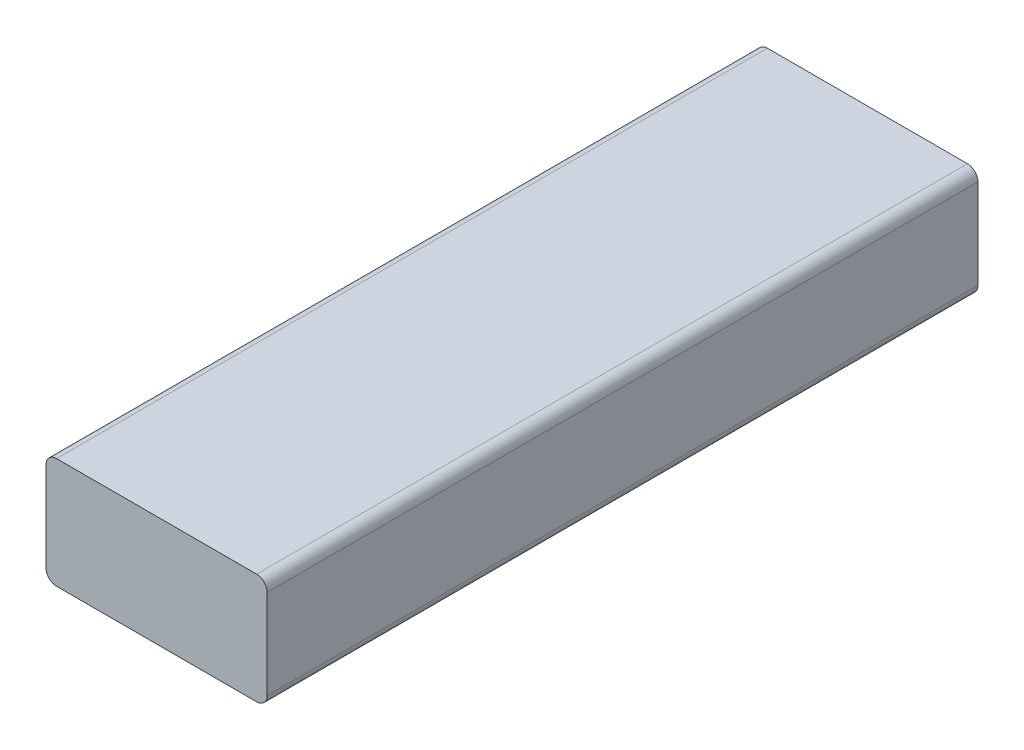
ISO-10303-21;
HEADER;
FILE_DESCRIPTION(('STEP AP214'),'2;1');
FILE_NAME('part.step','',(''),(''),'','','');
FILE_SCHEMA(('AUTOMOTIVE_DESIGN { 1 0 10303 214 1 1 1 1 }'));
ENDSEC;
DATA;
#1=APPLICATION_CONTEXT('core data for automotive mechanical design processes');
#2=APPLICATION_PROTOCOL_DEFINITION('international standard','automotive_design',2000,#1);
#3=PRODUCT_CONTEXT('',#1,'mechanical');
#4=PRODUCT('Part','Part','',(#3));
#5=PRODUCT_RELATED_PRODUCT_CATEGORY('part','',(#4));
#6=PRODUCT_DEFINITION_FORMATION('','',#4);
#7=PRODUCT_DEFINITION_CONTEXT('part definition',#1,'design');
#8=PRODUCT_DEFINITION('design','',#6,#7);
#9=PRODUCT_DEFINITION_SHAPE('','',#8);
#10=(LENGTH_UNIT() NAMED_UNIT(*) SI_UNIT(.MILLI.,.METRE.));
#11=(NAMED_UNIT(*) PLANE_ANGLE_UNIT() SI_UNIT($,.RADIAN.));
#12=(NAMED_UNIT(*) SI_UNIT($,.STERADIAN.) SOLID_ANGLE_UNIT());
#13=UNCERTAINTY_MEASURE_WITH_UNIT(LENGTH_MEASURE(1.E-05),#10,'distance_accuracy_value','');
#14=(GEOMETRIC_REPRESENTATION_CONTEXT(3) GLOBAL_UNCERTAINTY_ASSIGNED_CONTEXT((#13)) GLOBAL_UNIT_ASSIGNED_CONTEXT((#10,
#11,#12)) REPRESENTATION_CONTEXT('',''));
#15=CARTESIAN_POINT('',(0.,0.,0.));
#16=DIRECTION('',(0.,0.,1.));
#17=DIRECTION('',(1.,0.,0.));
#18=AXIS2_PLACEMENT_3D('',#15,#16,#17);
#19=CARTESIAN_POINT('',(-26.0432147002653,21.,-112.009057315892));
#20=DIRECTION('',(0.,0.,-1.));
#21=DIRECTION('',(-1.,0.,0.));
#22=AXIS2_PLACEMENT_3D('',#19,#20,#21);
#23=PLANE('',#22);
#24=DIRECTION('',(1.,0.,0.));
#25=VECTOR('',#24,1.);
#26=CARTESIAN_POINT('',(-26.0432147002653,0.,-112.009057315892));
#27=LINE('',#26,#25);
#28=CARTESIAN_POINT('',(-24.0432147002653,0.,-112.009057315892));
#29=VERTEX_POINT('',#28);
#30=CARTESIAN_POINT('',(13.9567852997347,0.,-112.009057315892));
#31=VERTEX_POINT('',#30);
#32=EDGE_CURVE('E162',#29,#31,#27,.T.);
#33=ORIENTED_EDGE('',*,*,#32,.F.);
#34=CARTESIAN_POINT('',(-24.0432147002653,2.,-112.009057315892));
#35=DIRECTION('',(0.,0.,-1.));
#36=DIRECTION('',(-1.,0.,0.));
#37=AXIS2_PLACEMENT_3D('',#34,#35,#36);
#38=CIRCLE('',#37,2.);
#39=CARTESIAN_POINT('',(-26.0432147002653,2.00000000000001,-112.009057315892));
#40=VERTEX_POINT('',#39);
#41=EDGE_CURVE('E148',#29,#40,#38,.T.);
#42=ORIENTED_EDGE('',*,*,#41,.T.);
#43=DIRECTION('',(0.,-1.,0.));
#44=VECTOR('',#43,1.);
#45=CARTESIAN_POINT('',(-26.0432147002653,21.,-112.009057315892));
#46=LINE('',#45,#44);
#47=CARTESIAN_POINT('',(-26.0432147002653,19.,-112.009057315892));
#48=VERTEX_POINT('',#47);
#49=EDGE_CURVE('E122',#48,#40,#46,.T.);
#50=ORIENTED_EDGE('',*,*,#49,.F.);
#51=CARTESIAN_POINT('',(-24.0432147002653,19.,-112.009057315892));
#52=DIRECTION('',(0.,0.,-1.));
#53=DIRECTION('',(-1.,0.,0.));
#54=AXIS2_PLACEMENT_3D('',#51,#52,#53);
#55=CIRCLE('',#54,2.);
#56=CARTESIAN_POINT('',(-24.0432147002653,21.,-112.009057315892));
#57=VERTEX_POINT('',#56);
#58=EDGE_CURVE('E126',#48,#57,#55,.T.);
#59=ORIENTED_EDGE('',*,*,#58,.T.);
#60=DIRECTION('',(1.,0.,0.));
#61=VECTOR('',#60,1.);
#62=CARTESIAN_POINT('',(-26.0432147002653,21.,-112.009057315892));
#63=LINE('',#62,#61);
#64=CARTESIAN_POINT('',(13.9567852997347,21.,-112.009057315892));
#65=VERTEX_POINT('',#64);
#66=EDGE_CURVE('E157',#57,#65,#63,.T.);
#67=ORIENTED_EDGE('',*,*,#66,.T.);
#68=CARTESIAN_POINT('',(13.9567852997347,19.,-112.009057315892));
#69=DIRECTION('',(0.,0.,-1.));
#70=DIRECTION('',(-1.,0.,0.));
#71=AXIS2_PLACEMENT_3D('',#68,#69,#70);
#72=CIRCLE('',#71,2.);
#73=CARTESIAN_POINT('',(15.9567852997347,19.,-112.009057315892));
#74=VERTEX_POINT('',#73);
#75=EDGE_CURVE('E58',#65,#74,#72,.T.);
#76=ORIENTED_EDGE('',*,*,#75,.T.);
#77=DIRECTION('',(0.,-1.,0.));
#78=VECTOR('',#77,1.);
#79=CARTESIAN_POINT('',(15.9567852997347,21.,-112.009057315892));
#80=LINE('',#79,#78);
#81=CARTESIAN_POINT('',(15.9567852997347,2.00000000000001,-112.009057315892));
#82=VERTEX_POINT('',#81);
#83=EDGE_CURVE('E131',#74,#82,#80,.T.);
#84=ORIENTED_EDGE('',*,*,#83,.T.);
#85=CARTESIAN_POINT('',(13.9567852997347,2.,-112.009057315892));
#86=DIRECTION('',(0.,0.,-1.));
#87=DIRECTION('',(-1.,0.,0.));
#88=AXIS2_PLACEMENT_3D('',#85,#86,#87);
#89=CIRCLE('',#88,2.);
#90=EDGE_CURVE('E146',#82,#31,#89,.T.);
#91=ORIENTED_EDGE('',*,*,#90,.T.);
#92=EDGE_LOOP('',(#33,#42,#50,#59,#67,#76,#84,#91));
#93=FACE_BOUND('',#92,.T.);
#94=ADVANCED_FACE('F36',(#93),#23,.T.);
#95=CARTESIAN_POINT('',(-26.0432147002653,21.,-112.009057315892));
#96=DIRECTION('',(1.,0.,0.));
#97=DIRECTION('',(0.,0.,-1.));
#98=AXIS2_PLACEMENT_3D('',#95,#96,#97);
#99=PLANE('',#98);
#100=ORIENTED_EDGE('',*,*,#49,.T.);
#101=DIRECTION('',(0.,0.,1.));
#102=VECTOR('',#101,1.);
#103=CARTESIAN_POINT('',(-26.0432147002653,2.,22.9909426841084));
#104=LINE('',#103,#102);
#105=CARTESIAN_POINT('',(-26.0432147002653,2.00000000000001,22.9909426841084));
#106=VERTEX_POINT('',#105);
#107=EDGE_CURVE('E113',#40,#106,#104,.T.);
#108=ORIENTED_EDGE('',*,*,#107,.T.);
#109=DIRECTION('',(0.,-1.,0.));
#110=VECTOR('',#109,1.);
#111=CARTESIAN_POINT('',(-26.0432147002653,21.,22.9909426841084));
#112=LINE('',#111,#110);
#113=CARTESIAN_POINT('',(-26.0432147002653,19.,22.9909426841084));
#114=VERTEX_POINT('',#113);
#115=EDGE_CURVE('E105',#114,#106,#112,.T.);
#116=ORIENTED_EDGE('',*,*,#115,.F.);
#117=DIRECTION('',(0.,0.,1.));
#118=VECTOR('',#117,1.);
#119=CARTESIAN_POINT('',(-26.0432147002653,19.,-112.009057315892));
#120=LINE('',#119,#118);
#121=EDGE_CURVE('E119',#114,#48,#120,.F.);
#122=ORIENTED_EDGE('',*,*,#121,.T.);
#123=EDGE_LOOP('',(#100,#108,#116,#122));
#124=FACE_BOUND('',#123,.T.);
#125=ADVANCED_FACE('F118',(#124),#99,.F.);
#126=CARTESIAN_POINT('',(-26.0432147002653,21.,22.9909426841084));
#127=DIRECTION('',(0.,0.,-1.));
#128=DIRECTION('',(-1.,0.,0.));
#129=AXIS2_PLACEMENT_3D('',#126,#127,#128);
#130=PLANE('',#129);
#131=ORIENTED_EDGE('',*,*,#115,.T.);
#132=CARTESIAN_POINT('',(-24.0432147002653,2.,22.9909426841084));
#133=DIRECTION('',(0.,0.,-1.));
#134=DIRECTION('',(-1.,0.,0.));
#135=AXIS2_PLACEMENT_3D('',#132,#133,#134);
#136=CIRCLE('',#135,2.);
#137=CARTESIAN_POINT('',(-24.0432147002653,0.,22.9909426841084));
#138=VERTEX_POINT('',#137);
#139=EDGE_CURVE('E137',#106,#138,#136,.F.);
#140=ORIENTED_EDGE('',*,*,#139,.T.);
#141=DIRECTION('',(1.,0.,0.));
#142=VECTOR('',#141,1.);
#143=CARTESIAN_POINT('',(-26.0432147002653,0.,22.9909426841084));
#144=LINE('',#143,#142);
#145=CARTESIAN_POINT('',(13.9567852997347,0.,22.9909426841084));
#146=VERTEX_POINT('',#145);
#147=EDGE_CURVE('E158',#138,#146,#144,.T.);
#148=ORIENTED_EDGE('',*,*,#147,.T.);
#149=CARTESIAN_POINT('',(13.9567852997347,2.,22.9909426841084));
#150=DIRECTION('',(0.,0.,-1.));
#151=DIRECTION('',(-1.,0.,0.));
#152=AXIS2_PLACEMENT_3D('',#149,#150,#151);
#153=CIRCLE('',#152,2.);
#154=CARTESIAN_POINT('',(15.9567852997347,2.00000000000001,22.9909426841084));
#155=VERTEX_POINT('',#154);
#156=EDGE_CURVE('E135',#146,#155,#153,.F.);
#157=ORIENTED_EDGE('',*,*,#156,.T.);
#158=DIRECTION('',(0.,-1.,0.));
#159=VECTOR('',#158,1.);
#160=CARTESIAN_POINT('',(15.9567852997347,21.,22.9909426841084));
#161=LINE('',#160,#159);
#162=CARTESIAN_POINT('',(15.9567852997347,19.,22.9909426841084));
#163=VERTEX_POINT('',#162);
#164=EDGE_CURVE('E123',#163,#155,#161,.T.);
#165=ORIENTED_EDGE('',*,*,#164,.F.);
#166=CARTESIAN_POINT('',(13.9567852997347,19.,22.9909426841084));
#167=DIRECTION('',(0.,0.,-1.));
#168=DIRECTION('',(-1.,0.,0.));
#169=AXIS2_PLACEMENT_3D('',#166,#167,#168);
#170=CIRCLE('',#169,2.);
#171=CARTESIAN_POINT('',(13.9567852997347,21.,22.9909426841084));
#172=VERTEX_POINT('',#171);
#173=EDGE_CURVE('E112',#163,#172,#170,.F.);
#174=ORIENTED_EDGE('',*,*,#173,.T.);
#175=DIRECTION('',(1.,0.,0.));
#176=VECTOR('',#175,1.);
#177=CARTESIAN_POINT('',(-26.0432147002653,21.,22.9909426841084));
#178=LINE('',#177,#176);
#179=CARTESIAN_POINT('',(-24.0432147002653,21.,22.9909426841084));
#180=VERTEX_POINT('',#179);
#181=EDGE_CURVE('E107',#180,#172,#178,.T.);
#182=ORIENTED_EDGE('',*,*,#181,.F.);
#183=CARTESIAN_POINT('',(-24.0432147002653,19.,22.9909426841084));
#184=DIRECTION('',(0.,0.,-1.));
#185=DIRECTION('',(-1.,0.,0.));
#186=AXIS2_PLACEMENT_3D('',#183,#184,#185);
#187=CIRCLE('',#186,2.);
#188=EDGE_CURVE('E102',#180,#114,#187,.F.);
#189=ORIENTED_EDGE('',*,*,#188,.T.);
#190=EDGE_LOOP('',(#131,#140,#148,#157,#165,#174,#182,#189));
#191=FACE_BOUND('',#190,.T.);
#192=ADVANCED_FACE('F104',(#191),#130,.F.);
#193=CARTESIAN_POINT('',(15.9567852997347,21.,-112.009057315892));
#194=DIRECTION('',(1.,0.,0.));
#195=DIRECTION('',(0.,0.,-1.));
#196=AXIS2_PLACEMENT_3D('',#193,#194,#195);
#197=PLANE('',#196);
#198=ORIENTED_EDGE('',*,*,#164,.T.);
#199=DIRECTION('',(0.,0.,1.));
#200=VECTOR('',#199,1.);
#201=CARTESIAN_POINT('',(15.9567852997347,2.,-112.009057315892));
#202=LINE('',#201,#200);
#203=EDGE_CURVE('E51',#155,#82,#202,.F.);
#204=ORIENTED_EDGE('',*,*,#203,.T.);
#205=ORIENTED_EDGE('',*,*,#83,.F.);
#206=DIRECTION('',(0.,0.,1.));
#207=VECTOR('',#206,1.);
#208=CARTESIAN_POINT('',(15.9567852997347,19.,22.9909426841084));
#209=LINE('',#208,#207);
#210=EDGE_CURVE('E150',#74,#163,#209,.T.);
#211=ORIENTED_EDGE('',*,*,#210,.T.);
#212=EDGE_LOOP('',(#198,#204,#205,#211));
#213=FACE_BOUND('',#212,.T.);
#214=ADVANCED_FACE('F196',(#213),#197,.T.);
#215=CARTESIAN_POINT('',(0.,21.,0.));
#216=DIRECTION('',(0.,-1.,0.));
#217=DIRECTION('',(0.,0.,-1.));
#218=AXIS2_PLACEMENT_3D('',#215,#216,#217);
#219=PLANE('',#218);
#220=ORIENTED_EDGE('',*,*,#181,.T.);
#221=DIRECTION('',(0.,0.,1.));
#222=VECTOR('',#221,1.);
#223=CARTESIAN_POINT('',(13.9567852997347,21.,-112.009057315892));
#224=LINE('',#223,#222);
#225=EDGE_CURVE('E11',#172,#65,#224,.F.);
#226=ORIENTED_EDGE('',*,*,#225,.T.);
#227=ORIENTED_EDGE('',*,*,#66,.F.);
#228=DIRECTION('',(0.,0.,1.));
#229=VECTOR('',#228,1.);
#230=CARTESIAN_POINT('',(-24.0432147002653,21.,0.));
#231=LINE('',#230,#229);
#232=EDGE_CURVE('E44',#57,#180,#231,.T.);
#233=ORIENTED_EDGE('',*,*,#232,.T.);
#234=EDGE_LOOP('',(#220,#226,#227,#233));
#235=FACE_BOUND('',#234,.T.);
#236=ADVANCED_FACE('F155',(#235),#219,.F.);
#237=CARTESIAN_POINT('',(0.,0.,0.));
#238=DIRECTION('',(0.,-1.,0.));
#239=DIRECTION('',(0.,0.,-1.));
#240=AXIS2_PLACEMENT_3D('',#237,#238,#239);
#241=PLANE('',#240);
#242=ORIENTED_EDGE('',*,*,#147,.F.);
#243=DIRECTION('',(0.,0.,1.));
#244=VECTOR('',#243,1.);
#245=CARTESIAN_POINT('',(-24.0432147002653,0.,-112.009057315892));
#246=LINE('',#245,#244);
#247=EDGE_CURVE('E142',#138,#29,#246,.F.);
#248=ORIENTED_EDGE('',*,*,#247,.T.);
#249=ORIENTED_EDGE('',*,*,#32,.T.);
#250=DIRECTION('',(0.,0.,1.));
#251=VECTOR('',#250,1.);
#252=CARTESIAN_POINT('',(13.9567852997347,0.,0.));
#253=LINE('',#252,#251);
#254=EDGE_CURVE('E139',#31,#146,#253,.T.);
#255=ORIENTED_EDGE('',*,*,#254,.T.);
#256=EDGE_LOOP('',(#242,#248,#249,#255));
#257=FACE_BOUND('',#256,.T.);
#258=ADVANCED_FACE('F175',(#257),#241,.T.);
#259=CARTESIAN_POINT('',(-24.0432147002653,2.,-112.009057315892));
#260=DIRECTION('',(0.,0.,-1.));
#261=DIRECTION('',(-1.,0.,0.));
#262=AXIS2_PLACEMENT_3D('',#259,#260,#261);
#263=CYLINDRICAL_SURFACE('',#262,2.);
#264=ORIENTED_EDGE('',*,*,#41,.F.);
#265=ORIENTED_EDGE('',*,*,#247,.F.);
#266=ORIENTED_EDGE('',*,*,#139,.F.);
#267=ORIENTED_EDGE('',*,*,#107,.F.);
#268=EDGE_LOOP('',(#264,#265,#266,#267));
#269=FACE_BOUND('',#268,.T.);
#270=ADVANCED_FACE('F179',(#269),#263,.T.);
#271=CARTESIAN_POINT('',(13.9567852997347,2.,0.));
#272=DIRECTION('',(0.,0.,1.));
#273=DIRECTION('',(1.,0.,0.));
#274=AXIS2_PLACEMENT_3D('',#271,#272,#273);
#275=CYLINDRICAL_SURFACE('',#274,2.);
#276=ORIENTED_EDGE('',*,*,#90,.F.);
#277=ORIENTED_EDGE('',*,*,#203,.F.);
#278=ORIENTED_EDGE('',*,*,#156,.F.);
#279=ORIENTED_EDGE('',*,*,#254,.F.);
#280=EDGE_LOOP('',(#276,#277,#278,#279));
#281=FACE_BOUND('',#280,.T.);
#282=ADVANCED_FACE('F172',(#281),#275,.T.);
#283=CARTESIAN_POINT('',(13.9567852997347,19.,-112.009057315892));
#284=DIRECTION('',(0.,0.,-1.));
#285=DIRECTION('',(-1.,0.,0.));
#286=AXIS2_PLACEMENT_3D('',#283,#284,#285);
#287=CYLINDRICAL_SURFACE('',#286,2.);
#288=ORIENTED_EDGE('',*,*,#75,.F.);
#289=ORIENTED_EDGE('',*,*,#225,.F.);
#290=ORIENTED_EDGE('',*,*,#173,.F.);
#291=ORIENTED_EDGE('',*,*,#210,.F.);
#292=EDGE_LOOP('',(#288,#289,#290,#291));
#293=FACE_BOUND('',#292,.T.);
#294=ADVANCED_FACE('F186',(#293),#287,.T.);
#295=CARTESIAN_POINT('',(-24.0432147002653,19.,0.));
#296=DIRECTION('',(0.,0.,1.));
#297=DIRECTION('',(1.,0.,0.));
#298=AXIS2_PLACEMENT_3D('',#295,#296,#297);
#299=CYLINDRICAL_SURFACE('',#298,2.);
#300=ORIENTED_EDGE('',*,*,#58,.F.);
#301=ORIENTED_EDGE('',*,*,#121,.F.);
#302=ORIENTED_EDGE('',*,*,#188,.F.);
#303=ORIENTED_EDGE('',*,*,#232,.F.);
#304=EDGE_LOOP('',(#300,#301,#302,#303));
#305=FACE_BOUND('',#304,.T.);
#306=ADVANCED_FACE('F38',(#305),#299,.T.);
#307=CLOSED_SHELL('',(#94,#125,#192,#214,#236,#258,#270,#282,#294,#306));
#308=MANIFOLD_SOLID_BREP('B2',#307);
#309=ADVANCED_BREP_SHAPE_REPRESENTATION('',(#18,#308),#14);
#310=SHAPE_DEFINITION_REPRESENTATION(#9,#309);
ENDSEC;
END-ISO-10303-21;
